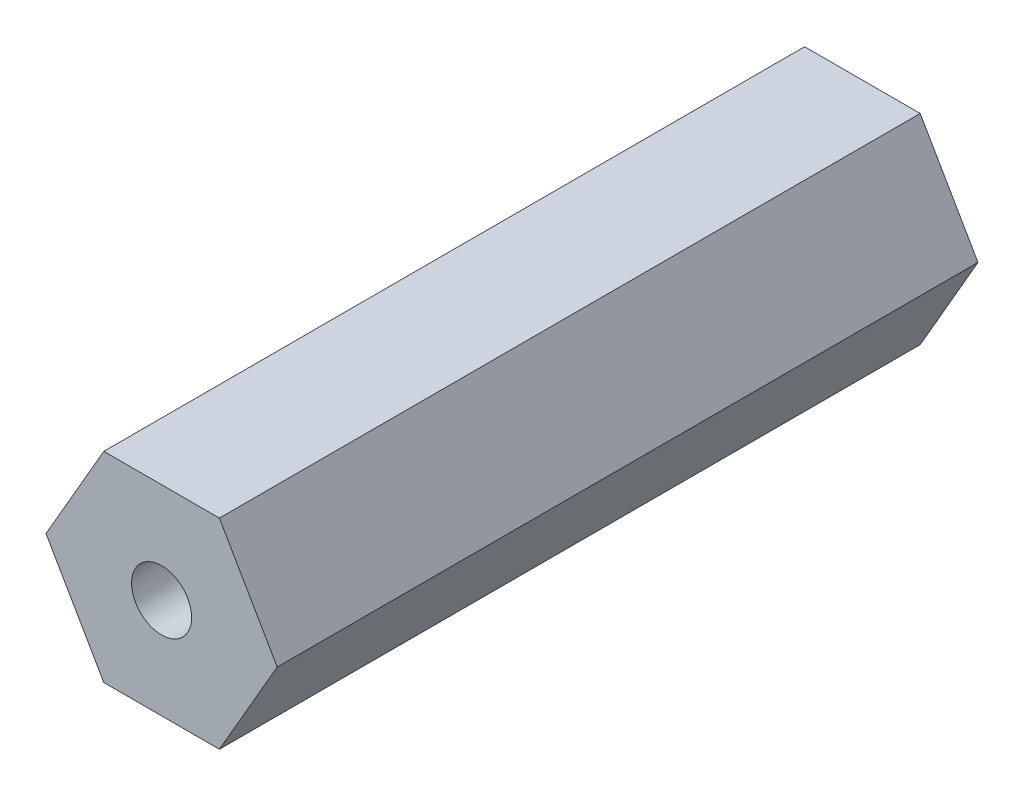
ISO-10303-21;
HEADER;
FILE_DESCRIPTION(('STEP AP214'),'2;1');
FILE_NAME('part.step','',(''),(''),'','','');
FILE_SCHEMA(('AUTOMOTIVE_DESIGN { 1 0 10303 214 1 1 1 1 }'));
ENDSEC;
DATA;
#1=APPLICATION_CONTEXT('core data for automotive mechanical design processes');
#2=APPLICATION_PROTOCOL_DEFINITION('international standard','automotive_design',2000,#1);
#3=PRODUCT_CONTEXT('',#1,'mechanical');
#4=PRODUCT('Part','Part','',(#3));
#5=PRODUCT_RELATED_PRODUCT_CATEGORY('part','',(#4));
#6=PRODUCT_DEFINITION_FORMATION('','',#4);
#7=PRODUCT_DEFINITION_CONTEXT('part definition',#1,'design');
#8=PRODUCT_DEFINITION('design','',#6,#7);
#9=PRODUCT_DEFINITION_SHAPE('','',#8);
#10=(LENGTH_UNIT() NAMED_UNIT(*) SI_UNIT(.MILLI.,.METRE.));
#11=(NAMED_UNIT(*) PLANE_ANGLE_UNIT() SI_UNIT($,.RADIAN.));
#12=(NAMED_UNIT(*) SI_UNIT($,.STERADIAN.) SOLID_ANGLE_UNIT());
#13=UNCERTAINTY_MEASURE_WITH_UNIT(LENGTH_MEASURE(1.E-05),#10,'distance_accuracy_value','');
#14=(GEOMETRIC_REPRESENTATION_CONTEXT(3) GLOBAL_UNCERTAINTY_ASSIGNED_CONTEXT((#13)) GLOBAL_UNIT_ASSIGNED_CONTEXT((#10,
#11,#12)) REPRESENTATION_CONTEXT('',''));
#15=CARTESIAN_POINT('',(0.,0.,0.));
#16=DIRECTION('',(0.,0.,1.));
#17=DIRECTION('',(1.,0.,0.));
#18=AXIS2_PLACEMENT_3D('',#15,#16,#17);
#19=CARTESIAN_POINT('',(0.,0.,35.));
#20=DIRECTION('',(0.,0.,1.));
#21=DIRECTION('',(1.,0.,0.));
#22=AXIS2_PLACEMENT_3D('',#19,#20,#21);
#23=PLANE('',#22);
#24=DIRECTION('',(0.5,0.866025403784439,0.));
#25=VECTOR('',#24,1.);
#26=CARTESIAN_POINT('',(2.88675134594813,-5.,35.));
#27=LINE('',#26,#25);
#28=CARTESIAN_POINT('',(2.88675134594813,-5.,35.));
#29=VERTEX_POINT('',#28);
#30=CARTESIAN_POINT('',(5.77350269189626,0.,35.));
#31=VERTEX_POINT('',#30);
#32=EDGE_CURVE('E129',#29,#31,#27,.T.);
#33=ORIENTED_EDGE('',*,*,#32,.T.);
#34=DIRECTION('',(-0.5,0.866025403784438,0.));
#35=VECTOR('',#34,1.);
#36=CARTESIAN_POINT('',(5.77350269189626,0.,35.));
#37=LINE('',#36,#35);
#38=CARTESIAN_POINT('',(2.88675134594812,5.00000000000001,35.));
#39=VERTEX_POINT('',#38);
#40=EDGE_CURVE('E87',#31,#39,#37,.T.);
#41=ORIENTED_EDGE('',*,*,#40,.T.);
#42=DIRECTION('',(-1.,0.,0.));
#43=VECTOR('',#42,1.);
#44=CARTESIAN_POINT('',(2.88675134594812,5.00000000000001,35.));
#45=LINE('',#44,#43);
#46=CARTESIAN_POINT('',(-2.88675134594813,5.,35.));
#47=VERTEX_POINT('',#46);
#48=EDGE_CURVE('E100',#39,#47,#45,.T.);
#49=ORIENTED_EDGE('',*,*,#48,.T.);
#50=DIRECTION('',(-0.5,-0.866025403784439,0.));
#51=VECTOR('',#50,1.);
#52=CARTESIAN_POINT('',(-2.88675134594813,5.,35.));
#53=LINE('',#52,#51);
#54=CARTESIAN_POINT('',(-5.77350269189626,0.,35.));
#55=VERTEX_POINT('',#54);
#56=EDGE_CURVE('E94',#47,#55,#53,.T.);
#57=ORIENTED_EDGE('',*,*,#56,.T.);
#58=DIRECTION('',(0.5,-0.866025403784439,0.));
#59=VECTOR('',#58,1.);
#60=CARTESIAN_POINT('',(-5.77350269189626,0.,35.));
#61=LINE('',#60,#59);
#62=CARTESIAN_POINT('',(-2.88675134594813,-5.,35.));
#63=VERTEX_POINT('',#62);
#64=EDGE_CURVE('E98',#55,#63,#61,.T.);
#65=ORIENTED_EDGE('',*,*,#64,.T.);
#66=DIRECTION('',(1.,0.,0.));
#67=VECTOR('',#66,1.);
#68=CARTESIAN_POINT('',(-2.88675134594813,-5.,35.));
#69=LINE('',#68,#67);
#70=EDGE_CURVE('E50',#63,#29,#69,.T.);
#71=ORIENTED_EDGE('',*,*,#70,.T.);
#72=EDGE_LOOP('',(#33,#41,#49,#57,#65,#71));
#73=FACE_BOUND('',#72,.T.);
#74=CARTESIAN_POINT('',(0.,0.,35.));
#75=DIRECTION('',(0.,0.,1.));
#76=DIRECTION('',(1.,0.,0.));
#77=AXIS2_PLACEMENT_3D('',#74,#75,#76);
#78=CIRCLE('',#77,1.5);
#79=CARTESIAN_POINT('',(1.5,0.,35.));
#80=VERTEX_POINT('',#79);
#81=EDGE_CURVE('E122',#80,#80,#78,.T.);
#82=ORIENTED_EDGE('',*,*,#81,.F.);
#83=EDGE_LOOP('',(#82));
#84=FACE_BOUND('',#83,.T.);
#85=ADVANCED_FACE('F33',(#73,#84),#23,.T.);
#86=CARTESIAN_POINT('',(0.,0.,0.));
#87=DIRECTION('',(0.,0.,1.));
#88=DIRECTION('',(1.,0.,0.));
#89=AXIS2_PLACEMENT_3D('',#86,#87,#88);
#90=PLANE('',#89);
#91=DIRECTION('',(0.5,0.866025403784439,0.));
#92=VECTOR('',#91,1.);
#93=CARTESIAN_POINT('',(2.88675134594813,-5.,0.));
#94=LINE('',#93,#92);
#95=CARTESIAN_POINT('',(2.88675134594813,-5.,0.));
#96=VERTEX_POINT('',#95);
#97=CARTESIAN_POINT('',(5.77350269189626,0.,0.));
#98=VERTEX_POINT('',#97);
#99=EDGE_CURVE('E118',#96,#98,#94,.T.);
#100=ORIENTED_EDGE('',*,*,#99,.F.);
#101=DIRECTION('',(1.,0.,0.));
#102=VECTOR('',#101,1.);
#103=CARTESIAN_POINT('',(-2.88675134594813,-5.,0.));
#104=LINE('',#103,#102);
#105=CARTESIAN_POINT('',(-2.88675134594813,-5.,0.));
#106=VERTEX_POINT('',#105);
#107=EDGE_CURVE('E79',#106,#96,#104,.T.);
#108=ORIENTED_EDGE('',*,*,#107,.F.);
#109=DIRECTION('',(0.5,-0.866025403784439,0.));
#110=VECTOR('',#109,1.);
#111=CARTESIAN_POINT('',(-5.77350269189626,0.,0.));
#112=LINE('',#111,#110);
#113=CARTESIAN_POINT('',(-5.77350269189626,0.,0.));
#114=VERTEX_POINT('',#113);
#115=EDGE_CURVE('E73',#114,#106,#112,.T.);
#116=ORIENTED_EDGE('',*,*,#115,.F.);
#117=DIRECTION('',(-0.5,-0.866025403784439,0.));
#118=VECTOR('',#117,1.);
#119=CARTESIAN_POINT('',(-2.88675134594813,5.,0.));
#120=LINE('',#119,#118);
#121=CARTESIAN_POINT('',(-2.88675134594813,5.,0.));
#122=VERTEX_POINT('',#121);
#123=EDGE_CURVE('E108',#122,#114,#120,.T.);
#124=ORIENTED_EDGE('',*,*,#123,.F.);
#125=DIRECTION('',(-1.,0.,0.));
#126=VECTOR('',#125,1.);
#127=CARTESIAN_POINT('',(2.88675134594812,5.00000000000001,0.));
#128=LINE('',#127,#126);
#129=CARTESIAN_POINT('',(2.88675134594812,5.00000000000001,0.));
#130=VERTEX_POINT('',#129);
#131=EDGE_CURVE('E124',#130,#122,#128,.T.);
#132=ORIENTED_EDGE('',*,*,#131,.F.);
#133=DIRECTION('',(-0.5,0.866025403784438,0.));
#134=VECTOR('',#133,1.);
#135=CARTESIAN_POINT('',(5.77350269189626,0.,0.));
#136=LINE('',#135,#134);
#137=EDGE_CURVE('E121',#98,#130,#136,.T.);
#138=ORIENTED_EDGE('',*,*,#137,.F.);
#139=EDGE_LOOP('',(#100,#108,#116,#124,#132,#138));
#140=FACE_BOUND('',#139,.T.);
#141=CARTESIAN_POINT('',(0.,0.,0.));
#142=DIRECTION('',(0.,0.,1.));
#143=DIRECTION('',(1.,0.,0.));
#144=AXIS2_PLACEMENT_3D('',#141,#142,#143);
#145=CIRCLE('',#144,1.5);
#146=CARTESIAN_POINT('',(1.5,0.,0.));
#147=VERTEX_POINT('',#146);
#148=EDGE_CURVE('E222',#147,#147,#145,.T.);
#149=ORIENTED_EDGE('',*,*,#148,.T.);
#150=EDGE_LOOP('',(#149));
#151=FACE_BOUND('',#150,.T.);
#152=ADVANCED_FACE('F138',(#140,#151),#90,.F.);
#153=CARTESIAN_POINT('',(2.88675134594813,-5.,35.));
#154=DIRECTION('',(-0.866025403784439,0.5,0.));
#155=DIRECTION('',(-0.5,-0.866025403784439,0.));
#156=AXIS2_PLACEMENT_3D('',#153,#154,#155);
#157=PLANE('',#156);
#158=ORIENTED_EDGE('',*,*,#99,.T.);
#159=DIRECTION('',(0.,0.,-1.));
#160=VECTOR('',#159,1.);
#161=CARTESIAN_POINT('',(5.77350269189626,0.,35.));
#162=LINE('',#161,#160);
#163=EDGE_CURVE('E11',#31,#98,#162,.T.);
#164=ORIENTED_EDGE('',*,*,#163,.F.);
#165=ORIENTED_EDGE('',*,*,#32,.F.);
#166=DIRECTION('',(0.,0.,-1.));
#167=VECTOR('',#166,1.);
#168=CARTESIAN_POINT('',(2.88675134594813,-5.,35.));
#169=LINE('',#168,#167);
#170=EDGE_CURVE('E114',#29,#96,#169,.T.);
#171=ORIENTED_EDGE('',*,*,#170,.T.);
#172=EDGE_LOOP('',(#158,#164,#165,#171));
#173=FACE_BOUND('',#172,.T.);
#174=ADVANCED_FACE('F35',(#173),#157,.F.);
#175=CARTESIAN_POINT('',(5.77350269189626,0.,35.));
#176=DIRECTION('',(-0.866025403784439,-0.5,0.));
#177=DIRECTION('',(0.5,-0.866025403784439,0.));
#178=AXIS2_PLACEMENT_3D('',#175,#176,#177);
#179=PLANE('',#178);
#180=ORIENTED_EDGE('',*,*,#137,.T.);
#181=DIRECTION('',(0.,0.,-1.));
#182=VECTOR('',#181,1.);
#183=CARTESIAN_POINT('',(2.88675134594812,5.00000000000001,35.));
#184=LINE('',#183,#182);
#185=EDGE_CURVE('E42',#39,#130,#184,.T.);
#186=ORIENTED_EDGE('',*,*,#185,.F.);
#187=ORIENTED_EDGE('',*,*,#40,.F.);
#188=ORIENTED_EDGE('',*,*,#163,.T.);
#189=EDGE_LOOP('',(#180,#186,#187,#188));
#190=FACE_BOUND('',#189,.T.);
#191=ADVANCED_FACE('F163',(#190),#179,.F.);
#192=CARTESIAN_POINT('',(2.88675134594812,5.00000000000001,35.));
#193=DIRECTION('',(0.,-1.,0.));
#194=DIRECTION('',(1.,0.,0.));
#195=AXIS2_PLACEMENT_3D('',#192,#193,#194);
#196=PLANE('',#195);
#197=ORIENTED_EDGE('',*,*,#131,.T.);
#198=DIRECTION('',(0.,0.,-1.));
#199=VECTOR('',#198,1.);
#200=CARTESIAN_POINT('',(-2.88675134594813,5.,35.));
#201=LINE('',#200,#199);
#202=EDGE_CURVE('E109',#47,#122,#201,.T.);
#203=ORIENTED_EDGE('',*,*,#202,.F.);
#204=ORIENTED_EDGE('',*,*,#48,.F.);
#205=ORIENTED_EDGE('',*,*,#185,.T.);
#206=EDGE_LOOP('',(#197,#203,#204,#205));
#207=FACE_BOUND('',#206,.T.);
#208=ADVANCED_FACE('F135',(#207),#196,.F.);
#209=CARTESIAN_POINT('',(-2.88675134594813,5.,35.));
#210=DIRECTION('',(0.866025403784439,-0.5,0.));
#211=DIRECTION('',(0.5,0.866025403784439,0.));
#212=AXIS2_PLACEMENT_3D('',#209,#210,#211);
#213=PLANE('',#212);
#214=ORIENTED_EDGE('',*,*,#123,.T.);
#215=DIRECTION('',(0.,0.,-1.));
#216=VECTOR('',#215,1.);
#217=CARTESIAN_POINT('',(-5.77350269189626,0.,35.));
#218=LINE('',#217,#216);
#219=EDGE_CURVE('E105',#55,#114,#218,.T.);
#220=ORIENTED_EDGE('',*,*,#219,.F.);
#221=ORIENTED_EDGE('',*,*,#56,.F.);
#222=ORIENTED_EDGE('',*,*,#202,.T.);
#223=EDGE_LOOP('',(#214,#220,#221,#222));
#224=FACE_BOUND('',#223,.T.);
#225=ADVANCED_FACE('F106',(#224),#213,.F.);
#226=CARTESIAN_POINT('',(-5.77350269189626,0.,35.));
#227=DIRECTION('',(0.866025403784439,0.5,0.));
#228=DIRECTION('',(-0.5,0.866025403784439,0.));
#229=AXIS2_PLACEMENT_3D('',#226,#227,#228);
#230=PLANE('',#229);
#231=ORIENTED_EDGE('',*,*,#115,.T.);
#232=DIRECTION('',(0.,0.,-1.));
#233=VECTOR('',#232,1.);
#234=CARTESIAN_POINT('',(-2.88675134594813,-5.,35.));
#235=LINE('',#234,#233);
#236=EDGE_CURVE('E110',#63,#106,#235,.T.);
#237=ORIENTED_EDGE('',*,*,#236,.F.);
#238=ORIENTED_EDGE('',*,*,#64,.F.);
#239=ORIENTED_EDGE('',*,*,#219,.T.);
#240=EDGE_LOOP('',(#231,#237,#238,#239));
#241=FACE_BOUND('',#240,.T.);
#242=ADVANCED_FACE('F112',(#241),#230,.F.);
#243=CARTESIAN_POINT('',(-2.88675134594813,-5.,35.));
#244=DIRECTION('',(0.,1.,0.));
#245=DIRECTION('',(0.,0.,1.));
#246=AXIS2_PLACEMENT_3D('',#243,#244,#245);
#247=PLANE('',#246);
#248=ORIENTED_EDGE('',*,*,#107,.T.);
#249=ORIENTED_EDGE('',*,*,#170,.F.);
#250=ORIENTED_EDGE('',*,*,#70,.F.);
#251=ORIENTED_EDGE('',*,*,#236,.T.);
#252=EDGE_LOOP('',(#248,#249,#250,#251));
#253=FACE_BOUND('',#252,.T.);
#254=ADVANCED_FACE('F143',(#253),#247,.F.);
#255=CARTESIAN_POINT('',(0.,0.,35.));
#256=DIRECTION('',(0.,0.,-1.));
#257=DIRECTION('',(-1.,0.,0.));
#258=AXIS2_PLACEMENT_3D('',#255,#256,#257);
#259=CYLINDRICAL_SURFACE('',#258,1.5);
#260=ORIENTED_EDGE('',*,*,#81,.T.);
#261=EDGE_LOOP('',(#260));
#262=FACE_BOUND('',#261,.T.);
#263=ORIENTED_EDGE('',*,*,#148,.F.);
#264=EDGE_LOOP('',(#263));
#265=FACE_BOUND('',#264,.T.);
#266=ADVANCED_FACE('F145',(#262,#265),#259,.F.);
#267=CLOSED_SHELL('',(#85,#152,#174,#191,#208,#225,#242,#254,#266));
#268=MANIFOLD_SOLID_BREP('B2',#267);
#269=ADVANCED_BREP_SHAPE_REPRESENTATION('',(#18,#268),#14);
#270=SHAPE_DEFINITION_REPRESENTATION(#9,#269);
ENDSEC;
END-ISO-10303-21;
